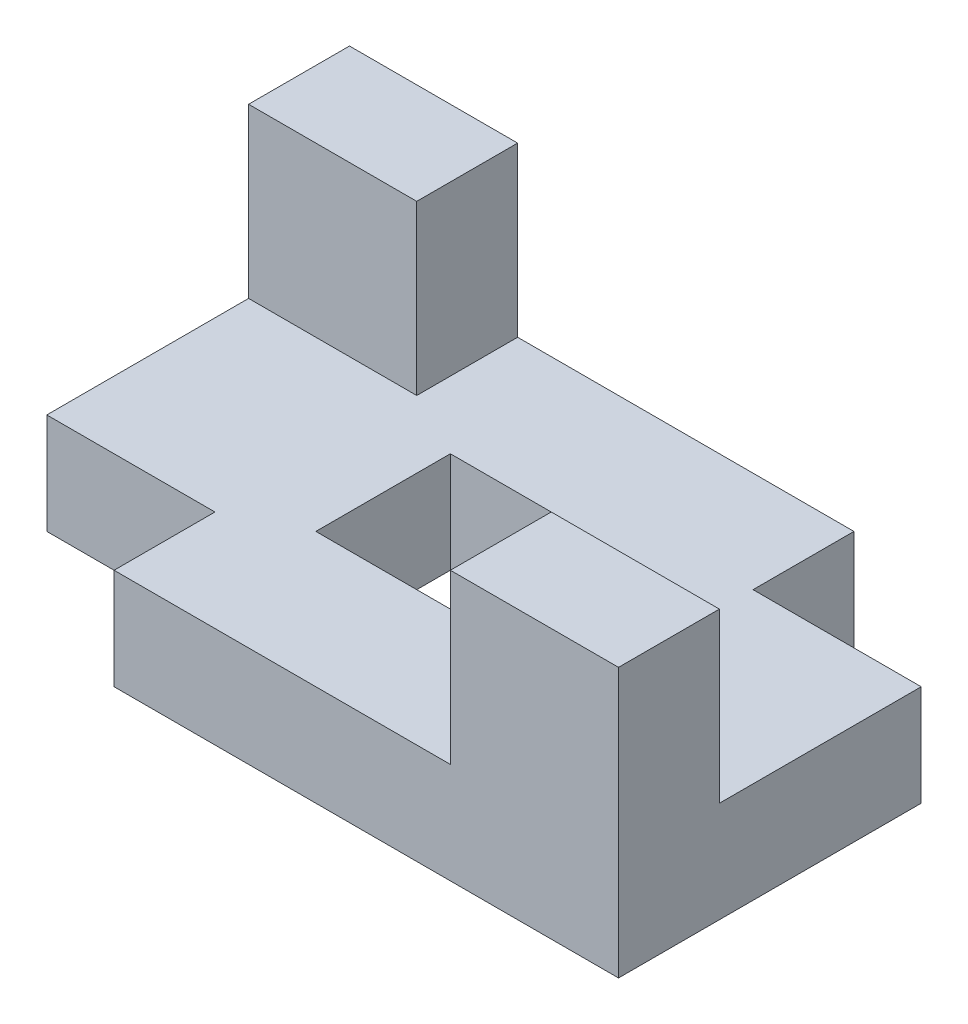
ISO-10303-21;
HEADER;
FILE_DESCRIPTION(('STEP AP214'),'2;1');
FILE_NAME('part.step','',(''),(''),'','','');
FILE_SCHEMA(('AUTOMOTIVE_DESIGN { 1 0 10303 214 1 1 1 1 }'));
ENDSEC;
DATA;
#1=APPLICATION_CONTEXT('core data for automotive mechanical design processes');
#2=APPLICATION_PROTOCOL_DEFINITION('international standard','automotive_design',2000,#1);
#3=PRODUCT_CONTEXT('',#1,'mechanical');
#4=PRODUCT('Part','Part','',(#3));
#5=PRODUCT_RELATED_PRODUCT_CATEGORY('part','',(#4));
#6=PRODUCT_DEFINITION_FORMATION('','',#4);
#7=PRODUCT_DEFINITION_CONTEXT('part definition',#1,'design');
#8=PRODUCT_DEFINITION('design','',#6,#7);
#9=PRODUCT_DEFINITION_SHAPE('','',#8);
#10=(LENGTH_UNIT() NAMED_UNIT(*) SI_UNIT(.MILLI.,.METRE.));
#11=(NAMED_UNIT(*) PLANE_ANGLE_UNIT() SI_UNIT($,.RADIAN.));
#12=(NAMED_UNIT(*) SI_UNIT($,.STERADIAN.) SOLID_ANGLE_UNIT());
#13=UNCERTAINTY_MEASURE_WITH_UNIT(LENGTH_MEASURE(1.E-05),#10,'distance_accuracy_value','');
#14=(GEOMETRIC_REPRESENTATION_CONTEXT(3) GLOBAL_UNCERTAINTY_ASSIGNED_CONTEXT((#13)) GLOBAL_UNIT_ASSIGNED_CONTEXT((#10,
#11,#12)) REPRESENTATION_CONTEXT('',''));
#15=CARTESIAN_POINT('',(0.,0.,0.));
#16=DIRECTION('',(0.,0.,1.));
#17=DIRECTION('',(1.,0.,0.));
#18=AXIS2_PLACEMENT_3D('',#15,#16,#17);
#19=CARTESIAN_POINT('',(0.,15.,0.));
#20=DIRECTION('',(0.,1.,0.));
#21=DIRECTION('',(0.,0.,1.));
#22=AXIS2_PLACEMENT_3D('',#19,#20,#21);
#23=PLANE('',#22);
#24=DIRECTION('',(0.,0.,-1.));
#25=VECTOR('',#24,1.);
#26=CARTESIAN_POINT('',(15.,15.,10.));
#27=LINE('',#26,#25);
#28=CARTESIAN_POINT('',(15.,15.,10.));
#29=VERTEX_POINT('',#28);
#30=CARTESIAN_POINT('',(15.,15.,-10.));
#31=VERTEX_POINT('',#30);
#32=EDGE_CURVE('E61',#29,#31,#27,.T.);
#33=ORIENTED_EDGE('',*,*,#32,.F.);
#34=DIRECTION('',(1.,0.,0.));
#35=VECTOR('',#34,1.);
#36=CARTESIAN_POINT('',(-15.,15.,10.));
#37=LINE('',#36,#35);
#38=CARTESIAN_POINT('',(-15.,15.,10.));
#39=VERTEX_POINT('',#38);
#40=EDGE_CURVE('E191',#39,#29,#37,.T.);
#41=ORIENTED_EDGE('',*,*,#40,.F.);
#42=DIRECTION('',(0.,0.,1.));
#43=VECTOR('',#42,1.);
#44=CARTESIAN_POINT('',(-15.,15.,10.));
#45=LINE('',#44,#43);
#46=CARTESIAN_POINT('',(-15.,15.,-10.));
#47=VERTEX_POINT('',#46);
#48=EDGE_CURVE('E174',#47,#39,#45,.T.);
#49=ORIENTED_EDGE('',*,*,#48,.F.);
#50=DIRECTION('',(-1.,0.,0.));
#51=VECTOR('',#50,1.);
#52=CARTESIAN_POINT('',(-15.,15.,-10.));
#53=LINE('',#52,#51);
#54=EDGE_CURVE('E184',#31,#47,#53,.T.);
#55=ORIENTED_EDGE('',*,*,#54,.F.);
#56=EDGE_LOOP('',(#33,#41,#49,#55));
#57=FACE_BOUND('',#56,.T.);
#58=DIRECTION('',(1.,0.,0.));
#59=VECTOR('',#58,1.);
#60=CARTESIAN_POINT('',(50.,15.,-15.));
#61=LINE('',#60,#59);
#62=CARTESIAN_POINT('',(25.,15.,-15.));
#63=VERTEX_POINT('',#62);
#64=CARTESIAN_POINT('',(50.,15.,-15.));
#65=VERTEX_POINT('',#64);
#66=EDGE_CURVE('E209',#63,#65,#61,.T.);
#67=ORIENTED_EDGE('',*,*,#66,.F.);
#68=DIRECTION('',(0.,0.,1.));
#69=VECTOR('',#68,1.);
#70=CARTESIAN_POINT('',(25.,15.,-30.));
#71=LINE('',#70,#69);
#72=CARTESIAN_POINT('',(25.,15.,-30.));
#73=VERTEX_POINT('',#72);
#74=EDGE_CURVE('E201',#73,#63,#71,.T.);
#75=ORIENTED_EDGE('',*,*,#74,.F.);
#76=DIRECTION('',(1.,0.,0.));
#77=VECTOR('',#76,1.);
#78=CARTESIAN_POINT('',(-50.,15.,-30.));
#79=LINE('',#78,#77);
#80=CARTESIAN_POINT('',(-25.,15.,-30.));
#81=VERTEX_POINT('',#80);
#82=EDGE_CURVE('E323',#81,#73,#79,.T.);
#83=ORIENTED_EDGE('',*,*,#82,.F.);
#84=DIRECTION('',(0.,0.,1.));
#85=VECTOR('',#84,1.);
#86=CARTESIAN_POINT('',(-25.,15.,-30.));
#87=LINE('',#86,#85);
#88=CARTESIAN_POINT('',(-25.,15.,-15.));
#89=VERTEX_POINT('',#88);
#90=EDGE_CURVE('E283',#81,#89,#87,.T.);
#91=ORIENTED_EDGE('',*,*,#90,.T.);
#92=DIRECTION('',(1.,0.,0.));
#93=VECTOR('',#92,1.);
#94=CARTESIAN_POINT('',(-50.,15.,-15.));
#95=LINE('',#94,#93);
#96=CARTESIAN_POINT('',(-50.,15.,-15.));
#97=VERTEX_POINT('',#96);
#98=EDGE_CURVE('E277',#97,#89,#95,.T.);
#99=ORIENTED_EDGE('',*,*,#98,.F.);
#100=DIRECTION('',(0.,0.,1.));
#101=VECTOR('',#100,1.);
#102=CARTESIAN_POINT('',(-50.,15.,-30.));
#103=LINE('',#102,#101);
#104=CARTESIAN_POINT('',(-50.,15.,15.));
#105=VERTEX_POINT('',#104);
#106=EDGE_CURVE('E312',#97,#105,#103,.T.);
#107=ORIENTED_EDGE('',*,*,#106,.T.);
#108=DIRECTION('',(-1.,0.,0.));
#109=VECTOR('',#108,1.);
#110=CARTESIAN_POINT('',(-25.,15.,15.));
#111=LINE('',#110,#109);
#112=CARTESIAN_POINT('',(-25.,15.,15.));
#113=VERTEX_POINT('',#112);
#114=EDGE_CURVE('E231',#113,#105,#111,.T.);
#115=ORIENTED_EDGE('',*,*,#114,.F.);
#116=DIRECTION('',(0.,0.,1.));
#117=VECTOR('',#116,1.);
#118=CARTESIAN_POINT('',(-25.,15.,15.));
#119=LINE('',#118,#117);
#120=CARTESIAN_POINT('',(-25.,15.,30.));
#121=VERTEX_POINT('',#120);
#122=EDGE_CURVE('E227',#113,#121,#119,.T.);
#123=ORIENTED_EDGE('',*,*,#122,.T.);
#124=DIRECTION('',(1.,0.,0.));
#125=VECTOR('',#124,1.);
#126=CARTESIAN_POINT('',(-50.,15.,30.));
#127=LINE('',#126,#125);
#128=CARTESIAN_POINT('',(25.,15.,30.));
#129=VERTEX_POINT('',#128);
#130=EDGE_CURVE('E316',#121,#129,#127,.T.);
#131=ORIENTED_EDGE('',*,*,#130,.T.);
#132=DIRECTION('',(0.,0.,1.));
#133=VECTOR('',#132,1.);
#134=CARTESIAN_POINT('',(25.,15.,30.));
#135=LINE('',#134,#133);
#136=CARTESIAN_POINT('',(25.,15.,15.));
#137=VERTEX_POINT('',#136);
#138=EDGE_CURVE('E250',#137,#129,#135,.T.);
#139=ORIENTED_EDGE('',*,*,#138,.F.);
#140=DIRECTION('',(-1.,0.,0.));
#141=VECTOR('',#140,1.);
#142=CARTESIAN_POINT('',(50.,15.,15.));
#143=LINE('',#142,#141);
#144=CARTESIAN_POINT('',(50.,15.,15.));
#145=VERTEX_POINT('',#144);
#146=EDGE_CURVE('E244',#145,#137,#143,.T.);
#147=ORIENTED_EDGE('',*,*,#146,.F.);
#148=DIRECTION('',(0.,0.,1.));
#149=VECTOR('',#148,1.);
#150=CARTESIAN_POINT('',(50.,15.,-30.));
#151=LINE('',#150,#149);
#152=EDGE_CURVE('E320',#65,#145,#151,.T.);
#153=ORIENTED_EDGE('',*,*,#152,.F.);
#154=EDGE_LOOP('',(#67,#75,#83,#91,#99,#107,#115,#123,#131,#139,#147,#153));
#155=FACE_BOUND('',#154,.T.);
#156=ADVANCED_FACE('F45',(#57,#155),#23,.T.);
#157=CARTESIAN_POINT('',(-50.,15.,30.));
#158=DIRECTION('',(0.,0.,-1.));
#159=DIRECTION('',(-1.,0.,0.));
#160=AXIS2_PLACEMENT_3D('',#157,#158,#159);
#161=PLANE('',#160);
#162=DIRECTION('',(0.,1.,0.));
#163=VECTOR('',#162,1.);
#164=CARTESIAN_POINT('',(-25.,-85.,30.));
#165=LINE('',#164,#163);
#166=CARTESIAN_POINT('',(-25.,0.,30.));
#167=VERTEX_POINT('',#166);
#168=EDGE_CURVE('E241',#167,#121,#165,.T.);
#169=ORIENTED_EDGE('',*,*,#168,.F.);
#170=DIRECTION('',(1.,0.,0.));
#171=VECTOR('',#170,1.);
#172=CARTESIAN_POINT('',(-50.,0.,30.));
#173=LINE('',#172,#171);
#174=CARTESIAN_POINT('',(50.,0.,30.));
#175=VERTEX_POINT('',#174);
#176=EDGE_CURVE('E331',#167,#175,#173,.T.);
#177=ORIENTED_EDGE('',*,*,#176,.T.);
#178=DIRECTION('',(0.,-1.,0.));
#179=VECTOR('',#178,1.);
#180=CARTESIAN_POINT('',(50.,15.,30.));
#181=LINE('',#180,#179);
#182=CARTESIAN_POINT('',(50.,40.,30.));
#183=VERTEX_POINT('',#182);
#184=EDGE_CURVE('E343',#183,#175,#181,.T.);
#185=ORIENTED_EDGE('',*,*,#184,.F.);
#186=DIRECTION('',(1.,0.,0.));
#187=VECTOR('',#186,1.);
#188=CARTESIAN_POINT('',(50.,40.,30.));
#189=LINE('',#188,#187);
#190=CARTESIAN_POINT('',(25.,40.,30.));
#191=VERTEX_POINT('',#190);
#192=EDGE_CURVE('E256',#191,#183,#189,.T.);
#193=ORIENTED_EDGE('',*,*,#192,.F.);
#194=DIRECTION('',(0.,-1.,0.));
#195=VECTOR('',#194,1.);
#196=CARTESIAN_POINT('',(25.,40.,30.));
#197=LINE('',#196,#195);
#198=EDGE_CURVE('E260',#191,#129,#197,.T.);
#199=ORIENTED_EDGE('',*,*,#198,.T.);
#200=ORIENTED_EDGE('',*,*,#130,.F.);
#201=EDGE_LOOP('',(#169,#177,#185,#193,#199,#200));
#202=FACE_BOUND('',#201,.T.);
#203=ADVANCED_FACE('F385',(#202),#161,.F.);
#204=CARTESIAN_POINT('',(0.,0.,0.));
#205=DIRECTION('',(0.,1.,0.));
#206=DIRECTION('',(0.,0.,1.));
#207=AXIS2_PLACEMENT_3D('',#204,#205,#206);
#208=PLANE('',#207);
#209=DIRECTION('',(1.,0.,0.));
#210=VECTOR('',#209,1.);
#211=CARTESIAN_POINT('',(0.,0.,10.));
#212=LINE('',#211,#210);
#213=CARTESIAN_POINT('',(-15.,0.,10.));
#214=VERTEX_POINT('',#213);
#215=CARTESIAN_POINT('',(15.,0.,10.));
#216=VERTEX_POINT('',#215);
#217=EDGE_CURVE('E54',#214,#216,#212,.T.);
#218=ORIENTED_EDGE('',*,*,#217,.T.);
#219=DIRECTION('',(0.,0.,-1.));
#220=VECTOR('',#219,1.);
#221=CARTESIAN_POINT('',(15.,0.,0.));
#222=LINE('',#221,#220);
#223=CARTESIAN_POINT('',(15.,0.,-10.));
#224=VERTEX_POINT('',#223);
#225=EDGE_CURVE('E11',#216,#224,#222,.T.);
#226=ORIENTED_EDGE('',*,*,#225,.T.);
#227=DIRECTION('',(-1.,0.,0.));
#228=VECTOR('',#227,1.);
#229=CARTESIAN_POINT('',(0.,0.,-10.));
#230=LINE('',#229,#228);
#231=CARTESIAN_POINT('',(-15.,0.,-10.));
#232=VERTEX_POINT('',#231);
#233=EDGE_CURVE('E357',#224,#232,#230,.T.);
#234=ORIENTED_EDGE('',*,*,#233,.T.);
#235=DIRECTION('',(0.,0.,1.));
#236=VECTOR('',#235,1.);
#237=CARTESIAN_POINT('',(-15.,0.,0.));
#238=LINE('',#237,#236);
#239=EDGE_CURVE('E177',#232,#214,#238,.T.);
#240=ORIENTED_EDGE('',*,*,#239,.T.);
#241=EDGE_LOOP('',(#218,#226,#234,#240));
#242=FACE_BOUND('',#241,.T.);
#243=DIRECTION('',(0.,0.,1.));
#244=VECTOR('',#243,1.);
#245=CARTESIAN_POINT('',(25.,0.,0.));
#246=LINE('',#245,#244);
#247=CARTESIAN_POINT('',(25.,0.,-30.));
#248=VERTEX_POINT('',#247);
#249=CARTESIAN_POINT('',(25.,0.,-15.));
#250=VERTEX_POINT('',#249);
#251=EDGE_CURVE('E217',#248,#250,#246,.T.);
#252=ORIENTED_EDGE('',*,*,#251,.T.);
#253=DIRECTION('',(1.,0.,0.));
#254=VECTOR('',#253,1.);
#255=CARTESIAN_POINT('',(0.,0.,-15.));
#256=LINE('',#255,#254);
#257=CARTESIAN_POINT('',(50.,0.,-15.));
#258=VERTEX_POINT('',#257);
#259=EDGE_CURVE('E223',#250,#258,#256,.T.);
#260=ORIENTED_EDGE('',*,*,#259,.T.);
#261=DIRECTION('',(0.,0.,1.));
#262=VECTOR('',#261,1.);
#263=CARTESIAN_POINT('',(50.,0.,-30.));
#264=LINE('',#263,#262);
#265=EDGE_CURVE('E335',#258,#175,#264,.T.);
#266=ORIENTED_EDGE('',*,*,#265,.T.);
#267=ORIENTED_EDGE('',*,*,#176,.F.);
#268=DIRECTION('',(0.,0.,1.));
#269=VECTOR('',#268,1.);
#270=CARTESIAN_POINT('',(-25.,0.,0.));
#271=LINE('',#270,#269);
#272=CARTESIAN_POINT('',(-25.,0.,15.));
#273=VERTEX_POINT('',#272);
#274=EDGE_CURVE('E351',#273,#167,#271,.T.);
#275=ORIENTED_EDGE('',*,*,#274,.F.);
#276=DIRECTION('',(-1.,0.,0.));
#277=VECTOR('',#276,1.);
#278=CARTESIAN_POINT('',(0.,0.,15.));
#279=LINE('',#278,#277);
#280=CARTESIAN_POINT('',(-50.,0.,15.));
#281=VERTEX_POINT('',#280);
#282=EDGE_CURVE('E347',#273,#281,#279,.T.);
#283=ORIENTED_EDGE('',*,*,#282,.T.);
#284=DIRECTION('',(0.,0.,1.));
#285=VECTOR('',#284,1.);
#286=CARTESIAN_POINT('',(-50.,0.,-30.));
#287=LINE('',#286,#285);
#288=CARTESIAN_POINT('',(-50.,0.,-30.));
#289=VERTEX_POINT('',#288);
#290=EDGE_CURVE('E311',#289,#281,#287,.T.);
#291=ORIENTED_EDGE('',*,*,#290,.F.);
#292=DIRECTION('',(1.,0.,0.));
#293=VECTOR('',#292,1.);
#294=CARTESIAN_POINT('',(-50.,0.,-30.));
#295=LINE('',#294,#293);
#296=EDGE_CURVE('E317',#289,#248,#295,.T.);
#297=ORIENTED_EDGE('',*,*,#296,.T.);
#298=EDGE_LOOP('',(#252,#260,#266,#267,#275,#283,#291,#297));
#299=FACE_BOUND('',#298,.T.);
#300=ADVANCED_FACE('F364',(#242,#299),#208,.F.);
#301=CARTESIAN_POINT('',(-50.,15.,-30.));
#302=DIRECTION('',(1.,0.,0.));
#303=DIRECTION('',(0.,0.,-1.));
#304=AXIS2_PLACEMENT_3D('',#301,#302,#303);
#305=PLANE('',#304);
#306=ORIENTED_EDGE('',*,*,#290,.T.);
#307=DIRECTION('',(0.,1.,0.));
#308=VECTOR('',#307,1.);
#309=CARTESIAN_POINT('',(-50.,-85.,15.));
#310=LINE('',#309,#308);
#311=EDGE_CURVE('E237',#281,#105,#310,.T.);
#312=ORIENTED_EDGE('',*,*,#311,.T.);
#313=ORIENTED_EDGE('',*,*,#106,.F.);
#314=DIRECTION('',(0.,-1.,0.));
#315=VECTOR('',#314,1.);
#316=CARTESIAN_POINT('',(-50.,40.,-15.));
#317=LINE('',#316,#315);
#318=CARTESIAN_POINT('',(-50.,40.,-15.));
#319=VERTEX_POINT('',#318);
#320=EDGE_CURVE('E307',#319,#97,#317,.T.);
#321=ORIENTED_EDGE('',*,*,#320,.F.);
#322=DIRECTION('',(0.,0.,1.));
#323=VECTOR('',#322,1.);
#324=CARTESIAN_POINT('',(-50.,40.,-30.));
#325=LINE('',#324,#323);
#326=CARTESIAN_POINT('',(-50.,40.,-30.));
#327=VERTEX_POINT('',#326);
#328=EDGE_CURVE('E278',#327,#319,#325,.T.);
#329=ORIENTED_EDGE('',*,*,#328,.F.);
#330=DIRECTION('',(0.,-1.,0.));
#331=VECTOR('',#330,1.);
#332=CARTESIAN_POINT('',(-50.,15.,-30.));
#333=LINE('',#332,#331);
#334=EDGE_CURVE('E327',#327,#289,#333,.T.);
#335=ORIENTED_EDGE('',*,*,#334,.T.);
#336=EDGE_LOOP('',(#306,#312,#313,#321,#329,#335));
#337=FACE_BOUND('',#336,.T.);
#338=ADVANCED_FACE('F47',(#337),#305,.F.);
#339=CARTESIAN_POINT('',(50.,15.,-30.));
#340=DIRECTION('',(1.,0.,0.));
#341=DIRECTION('',(0.,0.,-1.));
#342=AXIS2_PLACEMENT_3D('',#339,#340,#341);
#343=PLANE('',#342);
#344=DIRECTION('',(0.,1.,0.));
#345=VECTOR('',#344,1.);
#346=CARTESIAN_POINT('',(50.,-85.,-15.));
#347=LINE('',#346,#345);
#348=EDGE_CURVE('E213',#258,#65,#347,.T.);
#349=ORIENTED_EDGE('',*,*,#348,.T.);
#350=ORIENTED_EDGE('',*,*,#152,.T.);
#351=DIRECTION('',(0.,-1.,0.));
#352=VECTOR('',#351,1.);
#353=CARTESIAN_POINT('',(50.,40.,15.));
#354=LINE('',#353,#352);
#355=CARTESIAN_POINT('',(50.,40.,15.));
#356=VERTEX_POINT('',#355);
#357=EDGE_CURVE('E273',#356,#145,#354,.T.);
#358=ORIENTED_EDGE('',*,*,#357,.F.);
#359=DIRECTION('',(0.,0.,-1.));
#360=VECTOR('',#359,1.);
#361=CARTESIAN_POINT('',(50.,40.,30.));
#362=LINE('',#361,#360);
#363=EDGE_CURVE('E245',#183,#356,#362,.T.);
#364=ORIENTED_EDGE('',*,*,#363,.F.);
#365=ORIENTED_EDGE('',*,*,#184,.T.);
#366=ORIENTED_EDGE('',*,*,#265,.F.);
#367=EDGE_LOOP('',(#349,#350,#358,#364,#365,#366));
#368=FACE_BOUND('',#367,.T.);
#369=ADVANCED_FACE('F399',(#368),#343,.T.);
#370=CARTESIAN_POINT('',(-50.,15.,-30.));
#371=DIRECTION('',(0.,0.,-1.));
#372=DIRECTION('',(-1.,0.,0.));
#373=AXIS2_PLACEMENT_3D('',#370,#371,#372);
#374=PLANE('',#373);
#375=DIRECTION('',(0.,1.,0.));
#376=VECTOR('',#375,1.);
#377=CARTESIAN_POINT('',(25.,15.,-30.));
#378=LINE('',#377,#376);
#379=EDGE_CURVE('E354',#248,#73,#378,.T.);
#380=ORIENTED_EDGE('',*,*,#379,.F.);
#381=ORIENTED_EDGE('',*,*,#296,.F.);
#382=ORIENTED_EDGE('',*,*,#334,.F.);
#383=DIRECTION('',(1.,0.,0.));
#384=VECTOR('',#383,1.);
#385=CARTESIAN_POINT('',(-50.,40.,-30.));
#386=LINE('',#385,#384);
#387=CARTESIAN_POINT('',(-25.,40.,-30.));
#388=VERTEX_POINT('',#387);
#389=EDGE_CURVE('E290',#327,#388,#386,.T.);
#390=ORIENTED_EDGE('',*,*,#389,.T.);
#391=DIRECTION('',(0.,-1.,0.));
#392=VECTOR('',#391,1.);
#393=CARTESIAN_POINT('',(-25.,40.,-30.));
#394=LINE('',#393,#392);
#395=EDGE_CURVE('E294',#388,#81,#394,.T.);
#396=ORIENTED_EDGE('',*,*,#395,.T.);
#397=ORIENTED_EDGE('',*,*,#82,.T.);
#398=EDGE_LOOP('',(#380,#381,#382,#390,#396,#397));
#399=FACE_BOUND('',#398,.T.);
#400=ADVANCED_FACE('F396',(#399),#374,.T.);
#401=CARTESIAN_POINT('',(-50.,40.,-15.));
#402=DIRECTION('',(0.,0.,-1.));
#403=DIRECTION('',(-1.,0.,0.));
#404=AXIS2_PLACEMENT_3D('',#401,#402,#403);
#405=PLANE('',#404);
#406=ORIENTED_EDGE('',*,*,#98,.T.);
#407=DIRECTION('',(0.,-1.,0.));
#408=VECTOR('',#407,1.);
#409=CARTESIAN_POINT('',(-25.,40.,-15.));
#410=LINE('',#409,#408);
#411=CARTESIAN_POINT('',(-25.,40.,-15.));
#412=VERTEX_POINT('',#411);
#413=EDGE_CURVE('E303',#412,#89,#410,.T.);
#414=ORIENTED_EDGE('',*,*,#413,.F.);
#415=DIRECTION('',(1.,0.,0.));
#416=VECTOR('',#415,1.);
#417=CARTESIAN_POINT('',(-50.,40.,-15.));
#418=LINE('',#417,#416);
#419=EDGE_CURVE('E282',#319,#412,#418,.T.);
#420=ORIENTED_EDGE('',*,*,#419,.F.);
#421=ORIENTED_EDGE('',*,*,#320,.T.);
#422=EDGE_LOOP('',(#406,#414,#420,#421));
#423=FACE_BOUND('',#422,.T.);
#424=ADVANCED_FACE('F393',(#423),#405,.F.);
#425=CARTESIAN_POINT('',(-25.,40.,-30.));
#426=DIRECTION('',(1.,0.,0.));
#427=DIRECTION('',(0.,0.,-1.));
#428=AXIS2_PLACEMENT_3D('',#425,#426,#427);
#429=PLANE('',#428);
#430=ORIENTED_EDGE('',*,*,#90,.F.);
#431=ORIENTED_EDGE('',*,*,#395,.F.);
#432=DIRECTION('',(0.,0.,1.));
#433=VECTOR('',#432,1.);
#434=CARTESIAN_POINT('',(-25.,40.,-30.));
#435=LINE('',#434,#433);
#436=EDGE_CURVE('E286',#388,#412,#435,.T.);
#437=ORIENTED_EDGE('',*,*,#436,.T.);
#438=ORIENTED_EDGE('',*,*,#413,.T.);
#439=EDGE_LOOP('',(#430,#431,#437,#438));
#440=FACE_BOUND('',#439,.T.);
#441=ADVANCED_FACE('F438',(#440),#429,.T.);
#442=CARTESIAN_POINT('',(0.,40.,0.));
#443=DIRECTION('',(0.,1.,0.));
#444=DIRECTION('',(0.,0.,1.));
#445=AXIS2_PLACEMENT_3D('',#442,#443,#444);
#446=PLANE('',#445);
#447=ORIENTED_EDGE('',*,*,#328,.T.);
#448=ORIENTED_EDGE('',*,*,#419,.T.);
#449=ORIENTED_EDGE('',*,*,#436,.F.);
#450=ORIENTED_EDGE('',*,*,#389,.F.);
#451=EDGE_LOOP('',(#447,#448,#449,#450));
#452=FACE_BOUND('',#451,.T.);
#453=ADVANCED_FACE('F446',(#452),#446,.T.);
#454=CARTESIAN_POINT('',(50.,40.,15.));
#455=DIRECTION('',(0.,0.,1.));
#456=DIRECTION('',(1.,0.,0.));
#457=AXIS2_PLACEMENT_3D('',#454,#455,#456);
#458=PLANE('',#457);
#459=ORIENTED_EDGE('',*,*,#146,.T.);
#460=DIRECTION('',(0.,-1.,0.));
#461=VECTOR('',#460,1.);
#462=CARTESIAN_POINT('',(25.,40.,15.));
#463=LINE('',#462,#461);
#464=CARTESIAN_POINT('',(25.,40.,15.));
#465=VERTEX_POINT('',#464);
#466=EDGE_CURVE('E269',#465,#137,#463,.T.);
#467=ORIENTED_EDGE('',*,*,#466,.F.);
#468=DIRECTION('',(-1.,0.,0.));
#469=VECTOR('',#468,1.);
#470=CARTESIAN_POINT('',(50.,40.,15.));
#471=LINE('',#470,#469);
#472=EDGE_CURVE('E249',#356,#465,#471,.T.);
#473=ORIENTED_EDGE('',*,*,#472,.F.);
#474=ORIENTED_EDGE('',*,*,#357,.T.);
#475=EDGE_LOOP('',(#459,#467,#473,#474));
#476=FACE_BOUND('',#475,.T.);
#477=ADVANCED_FACE('F418',(#476),#458,.F.);
#478=CARTESIAN_POINT('',(25.,40.,30.));
#479=DIRECTION('',(1.,0.,0.));
#480=DIRECTION('',(0.,0.,-1.));
#481=AXIS2_PLACEMENT_3D('',#478,#479,#480);
#482=PLANE('',#481);
#483=ORIENTED_EDGE('',*,*,#138,.T.);
#484=ORIENTED_EDGE('',*,*,#198,.F.);
#485=DIRECTION('',(0.,0.,1.));
#486=VECTOR('',#485,1.);
#487=CARTESIAN_POINT('',(25.,40.,30.));
#488=LINE('',#487,#486);
#489=EDGE_CURVE('E253',#465,#191,#488,.T.);
#490=ORIENTED_EDGE('',*,*,#489,.F.);
#491=ORIENTED_EDGE('',*,*,#466,.T.);
#492=EDGE_LOOP('',(#483,#484,#490,#491));
#493=FACE_BOUND('',#492,.T.);
#494=ADVANCED_FACE('F421',(#493),#482,.F.);
#495=CARTESIAN_POINT('',(0.,40.,0.));
#496=DIRECTION('',(0.,1.,0.));
#497=DIRECTION('',(0.,0.,1.));
#498=AXIS2_PLACEMENT_3D('',#495,#496,#497);
#499=PLANE('',#498);
#500=ORIENTED_EDGE('',*,*,#363,.T.);
#501=ORIENTED_EDGE('',*,*,#472,.T.);
#502=ORIENTED_EDGE('',*,*,#489,.T.);
#503=ORIENTED_EDGE('',*,*,#192,.T.);
#504=EDGE_LOOP('',(#500,#501,#502,#503));
#505=FACE_BOUND('',#504,.T.);
#506=ADVANCED_FACE('F425',(#505),#499,.T.);
#507=CARTESIAN_POINT('',(-25.,-85.,15.));
#508=DIRECTION('',(-1.,0.,0.));
#509=DIRECTION('',(0.,0.,1.));
#510=AXIS2_PLACEMENT_3D('',#507,#508,#509);
#511=PLANE('',#510);
#512=ORIENTED_EDGE('',*,*,#274,.T.);
#513=ORIENTED_EDGE('',*,*,#168,.T.);
#514=ORIENTED_EDGE('',*,*,#122,.F.);
#515=DIRECTION('',(0.,1.,0.));
#516=VECTOR('',#515,1.);
#517=CARTESIAN_POINT('',(-25.,-85.,15.));
#518=LINE('',#517,#516);
#519=EDGE_CURVE('E234',#273,#113,#518,.T.);
#520=ORIENTED_EDGE('',*,*,#519,.F.);
#521=EDGE_LOOP('',(#512,#513,#514,#520));
#522=FACE_BOUND('',#521,.T.);
#523=ADVANCED_FACE('F453',(#522),#511,.T.);
#524=CARTESIAN_POINT('',(-25.,-85.,15.));
#525=DIRECTION('',(0.,0.,-1.));
#526=DIRECTION('',(-1.,0.,0.));
#527=AXIS2_PLACEMENT_3D('',#524,#525,#526);
#528=PLANE('',#527);
#529=ORIENTED_EDGE('',*,*,#519,.T.);
#530=ORIENTED_EDGE('',*,*,#114,.T.);
#531=ORIENTED_EDGE('',*,*,#311,.F.);
#532=ORIENTED_EDGE('',*,*,#282,.F.);
#533=EDGE_LOOP('',(#529,#530,#531,#532));
#534=FACE_BOUND('',#533,.T.);
#535=ADVANCED_FACE('F450',(#534),#528,.F.);
#536=CARTESIAN_POINT('',(50.,-85.,-15.));
#537=DIRECTION('',(0.,0.,1.));
#538=DIRECTION('',(1.,0.,0.));
#539=AXIS2_PLACEMENT_3D('',#536,#537,#538);
#540=PLANE('',#539);
#541=DIRECTION('',(0.,1.,0.));
#542=VECTOR('',#541,1.);
#543=CARTESIAN_POINT('',(25.,-85.,-15.));
#544=LINE('',#543,#542);
#545=EDGE_CURVE('E212',#250,#63,#544,.T.);
#546=ORIENTED_EDGE('',*,*,#545,.T.);
#547=ORIENTED_EDGE('',*,*,#66,.T.);
#548=ORIENTED_EDGE('',*,*,#348,.F.);
#549=ORIENTED_EDGE('',*,*,#259,.F.);
#550=EDGE_LOOP('',(#546,#547,#548,#549));
#551=FACE_BOUND('',#550,.T.);
#552=ADVANCED_FACE('F379',(#551),#540,.F.);
#553=CARTESIAN_POINT('',(25.,-85.,-30.));
#554=DIRECTION('',(-1.,0.,0.));
#555=DIRECTION('',(0.,0.,1.));
#556=AXIS2_PLACEMENT_3D('',#553,#554,#555);
#557=PLANE('',#556);
#558=ORIENTED_EDGE('',*,*,#379,.T.);
#559=ORIENTED_EDGE('',*,*,#74,.T.);
#560=ORIENTED_EDGE('',*,*,#545,.F.);
#561=ORIENTED_EDGE('',*,*,#251,.F.);
#562=EDGE_LOOP('',(#558,#559,#560,#561));
#563=FACE_BOUND('',#562,.T.);
#564=ADVANCED_FACE('F371',(#563),#557,.F.);
#565=CARTESIAN_POINT('',(15.,-85.,10.));
#566=DIRECTION('',(1.,0.,0.));
#567=DIRECTION('',(0.,0.,-1.));
#568=AXIS2_PLACEMENT_3D('',#565,#566,#567);
#569=PLANE('',#568);
#570=DIRECTION('',(0.,1.,0.));
#571=VECTOR('',#570,1.);
#572=CARTESIAN_POINT('',(15.,-85.,10.));
#573=LINE('',#572,#571);
#574=EDGE_CURVE('E198',#216,#29,#573,.T.);
#575=ORIENTED_EDGE('',*,*,#574,.T.);
#576=ORIENTED_EDGE('',*,*,#32,.T.);
#577=DIRECTION('',(0.,1.,0.));
#578=VECTOR('',#577,1.);
#579=CARTESIAN_POINT('',(15.,-85.,-10.));
#580=LINE('',#579,#578);
#581=EDGE_CURVE('E181',#224,#31,#580,.T.);
#582=ORIENTED_EDGE('',*,*,#581,.F.);
#583=ORIENTED_EDGE('',*,*,#225,.F.);
#584=EDGE_LOOP('',(#575,#576,#582,#583));
#585=FACE_BOUND('',#584,.T.);
#586=ADVANCED_FACE('F369',(#585),#569,.F.);
#587=CARTESIAN_POINT('',(-15.,-85.,10.));
#588=DIRECTION('',(0.,0.,1.));
#589=DIRECTION('',(1.,0.,0.));
#590=AXIS2_PLACEMENT_3D('',#587,#588,#589);
#591=PLANE('',#590);
#592=DIRECTION('',(0.,1.,0.));
#593=VECTOR('',#592,1.);
#594=CARTESIAN_POINT('',(-15.,-85.,10.));
#595=LINE('',#594,#593);
#596=EDGE_CURVE('E180',#214,#39,#595,.T.);
#597=ORIENTED_EDGE('',*,*,#596,.T.);
#598=ORIENTED_EDGE('',*,*,#40,.T.);
#599=ORIENTED_EDGE('',*,*,#574,.F.);
#600=ORIENTED_EDGE('',*,*,#217,.F.);
#601=EDGE_LOOP('',(#597,#598,#599,#600));
#602=FACE_BOUND('',#601,.T.);
#603=ADVANCED_FACE('F368',(#602),#591,.F.);
#604=CARTESIAN_POINT('',(-15.,-85.,10.));
#605=DIRECTION('',(-1.,0.,0.));
#606=DIRECTION('',(0.,0.,1.));
#607=AXIS2_PLACEMENT_3D('',#604,#605,#606);
#608=PLANE('',#607);
#609=DIRECTION('',(0.,1.,0.));
#610=VECTOR('',#609,1.);
#611=CARTESIAN_POINT('',(-15.,-85.,-10.));
#612=LINE('',#611,#610);
#613=EDGE_CURVE('E69',#232,#47,#612,.T.);
#614=ORIENTED_EDGE('',*,*,#613,.T.);
#615=ORIENTED_EDGE('',*,*,#48,.T.);
#616=ORIENTED_EDGE('',*,*,#596,.F.);
#617=ORIENTED_EDGE('',*,*,#239,.F.);
#618=EDGE_LOOP('',(#614,#615,#616,#617));
#619=FACE_BOUND('',#618,.T.);
#620=ADVANCED_FACE('F171',(#619),#608,.F.);
#621=CARTESIAN_POINT('',(-15.,-85.,-10.));
#622=DIRECTION('',(0.,0.,-1.));
#623=DIRECTION('',(-1.,0.,0.));
#624=AXIS2_PLACEMENT_3D('',#621,#622,#623);
#625=PLANE('',#624);
#626=ORIENTED_EDGE('',*,*,#581,.T.);
#627=ORIENTED_EDGE('',*,*,#54,.T.);
#628=ORIENTED_EDGE('',*,*,#613,.F.);
#629=ORIENTED_EDGE('',*,*,#233,.F.);
#630=EDGE_LOOP('',(#626,#627,#628,#629));
#631=FACE_BOUND('',#630,.T.);
#632=ADVANCED_FACE('F185',(#631),#625,.F.);
#633=CLOSED_SHELL('',(#156,#203,#300,#338,#369,#400,#424,#441,#453,#477,#494,#506,#523,#535,
#552,#564,#586,#603,#620,#632));
#634=MANIFOLD_SOLID_BREP('B2',#633);
#635=ADVANCED_BREP_SHAPE_REPRESENTATION('',(#18,#634),#14);
#636=SHAPE_DEFINITION_REPRESENTATION(#9,#635);
ENDSEC;
END-ISO-10303-21;
